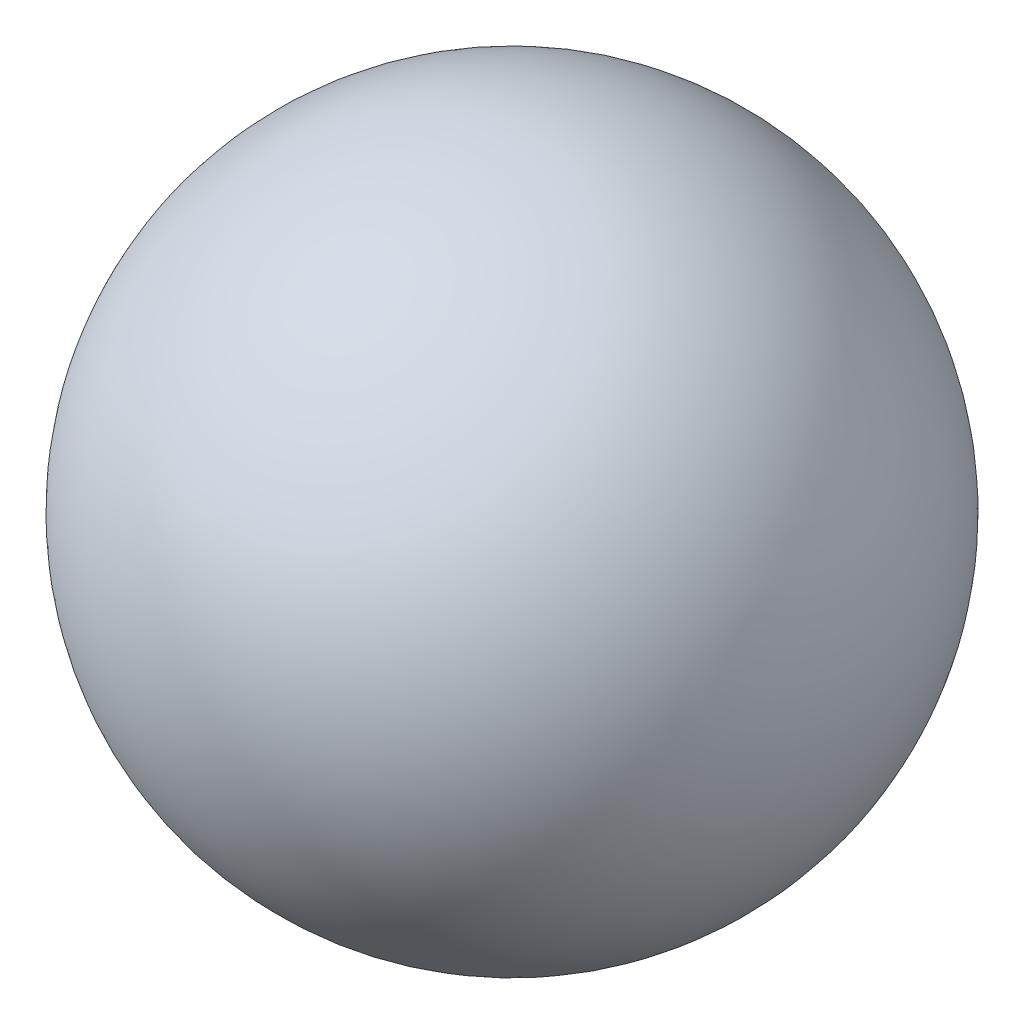
ISO-10303-21;
HEADER;
FILE_DESCRIPTION(('STEP AP214'),'2;1');
FILE_NAME('part.step','',(''),(''),'','','');
FILE_SCHEMA(('AUTOMOTIVE_DESIGN { 1 0 10303 214 1 1 1 1 }'));
ENDSEC;
DATA;
#1=APPLICATION_CONTEXT('core data for automotive mechanical design processes');
#2=APPLICATION_PROTOCOL_DEFINITION('international standard','automotive_design',2000,#1);
#3=PRODUCT_CONTEXT('',#1,'mechanical');
#4=PRODUCT('Part','Part','',(#3));
#5=PRODUCT_RELATED_PRODUCT_CATEGORY('part','',(#4));
#6=PRODUCT_DEFINITION_FORMATION('','',#4);
#7=PRODUCT_DEFINITION_CONTEXT('part definition',#1,'design');
#8=PRODUCT_DEFINITION('design','',#6,#7);
#9=PRODUCT_DEFINITION_SHAPE('','',#8);
#10=(LENGTH_UNIT() NAMED_UNIT(*) SI_UNIT(.MILLI.,.METRE.));
#11=(NAMED_UNIT(*) PLANE_ANGLE_UNIT() SI_UNIT($,.RADIAN.));
#12=(NAMED_UNIT(*) SI_UNIT($,.STERADIAN.) SOLID_ANGLE_UNIT());
#13=UNCERTAINTY_MEASURE_WITH_UNIT(LENGTH_MEASURE(1.E-05),#10,'distance_accuracy_value','');
#14=(GEOMETRIC_REPRESENTATION_CONTEXT(3) GLOBAL_UNCERTAINTY_ASSIGNED_CONTEXT((#13)) GLOBAL_UNIT_ASSIGNED_CONTEXT((#10,
#11,#12)) REPRESENTATION_CONTEXT('',''));
#15=CARTESIAN_POINT('',(0.,0.,0.));
#16=DIRECTION('',(0.,0.,1.));
#17=DIRECTION('',(1.,0.,0.));
#18=AXIS2_PLACEMENT_3D('',#15,#16,#17);
#19=CARTESIAN_POINT('',(18.5448193887903,0.,0.));
#20=DIRECTION('',(-1.,0.,0.));
#21=DIRECTION('',(0.,0.,-1.));
#22=AXIS2_PLACEMENT_3D('',#19,#20,#21);
#23=SPHERICAL_SURFACE('',#22,3.81);
#24=CARTESIAN_POINT('',(14.7348193887903,0.,0.));
#25=VERTEX_POINT('',#24);
#26=VERTEX_LOOP('',#25);
#27=FACE_BOUND('',#26,.T.);
#28=ADVANCED_FACE('F29',(#27),#23,.T.);
#29=CLOSED_SHELL('',(#28));
#30=MANIFOLD_SOLID_BREP('B2',#29);
#31=ADVANCED_BREP_SHAPE_REPRESENTATION('',(#18,#30),#14);
#32=SHAPE_DEFINITION_REPRESENTATION(#9,#31);
ENDSEC;
END-ISO-10303-21;
